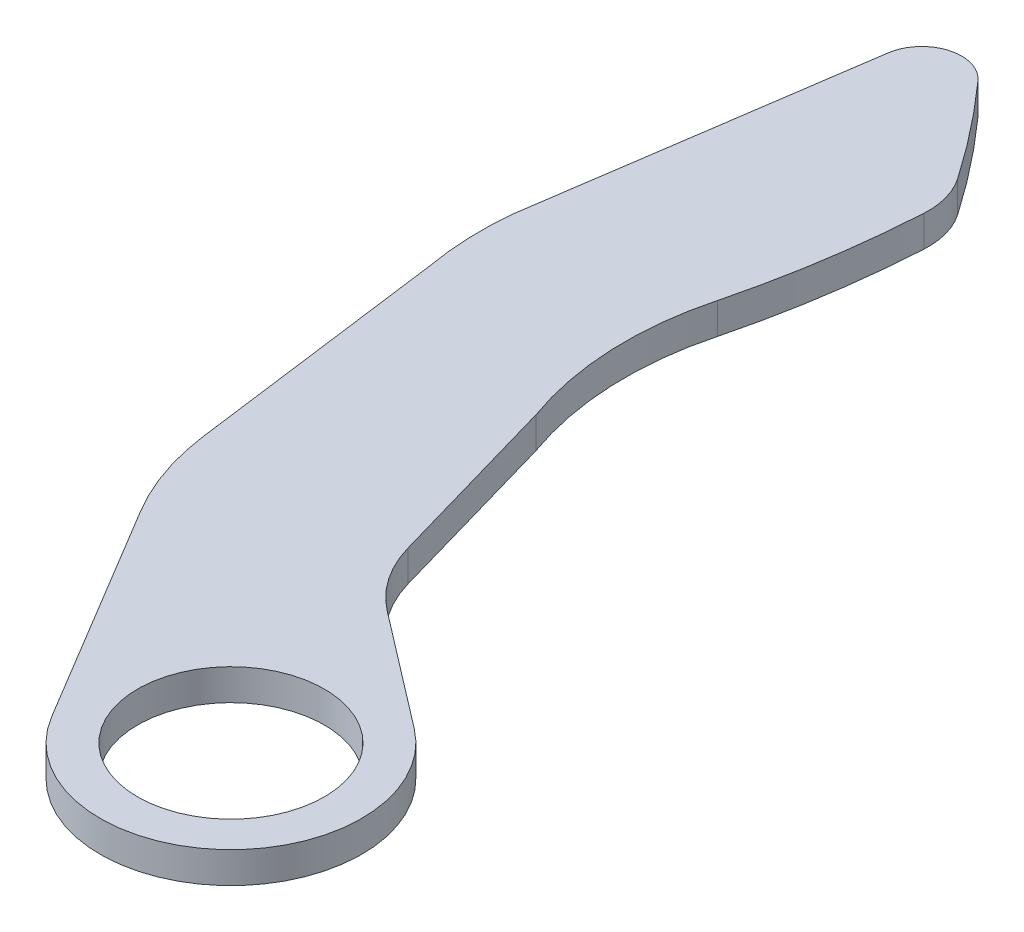
ISO-10303-21;
HEADER;
FILE_DESCRIPTION(('STEP AP214'),'2;1');
FILE_NAME('part.step','',(''),(''),'','','');
FILE_SCHEMA(('AUTOMOTIVE_DESIGN { 1 0 10303 214 1 1 1 1 }'));
ENDSEC;
DATA;
#1=APPLICATION_CONTEXT('core data for automotive mechanical design processes');
#2=APPLICATION_PROTOCOL_DEFINITION('international standard','automotive_design',2000,#1);
#3=PRODUCT_CONTEXT('',#1,'mechanical');
#4=PRODUCT('Part','Part','',(#3));
#5=PRODUCT_RELATED_PRODUCT_CATEGORY('part','',(#4));
#6=PRODUCT_DEFINITION_FORMATION('','',#4);
#7=PRODUCT_DEFINITION_CONTEXT('part definition',#1,'design');
#8=PRODUCT_DEFINITION('design','',#6,#7);
#9=PRODUCT_DEFINITION_SHAPE('','',#8);
#10=(LENGTH_UNIT() NAMED_UNIT(*) SI_UNIT(.MILLI.,.METRE.));
#11=(NAMED_UNIT(*) PLANE_ANGLE_UNIT() SI_UNIT($,.RADIAN.));
#12=(NAMED_UNIT(*) SI_UNIT($,.STERADIAN.) SOLID_ANGLE_UNIT());
#13=UNCERTAINTY_MEASURE_WITH_UNIT(LENGTH_MEASURE(1.E-05),#10,'distance_accuracy_value','');
#14=(GEOMETRIC_REPRESENTATION_CONTEXT(3) GLOBAL_UNCERTAINTY_ASSIGNED_CONTEXT((#13)) GLOBAL_UNIT_ASSIGNED_CONTEXT((#10,
#11,#12)) REPRESENTATION_CONTEXT('',''));
#15=CARTESIAN_POINT('',(0.,0.,0.));
#16=DIRECTION('',(0.,0.,1.));
#17=DIRECTION('',(1.,0.,0.));
#18=AXIS2_PLACEMENT_3D('',#15,#16,#17);
#19=CARTESIAN_POINT('',(0.,5.,0.));
#20=DIRECTION('',(0.,-1.,0.));
#21=DIRECTION('',(0.,0.,-1.));
#22=AXIS2_PLACEMENT_3D('',#19,#20,#21);
#23=PLANE('',#22);
#24=CARTESIAN_POINT('',(0.,5.,0.));
#25=DIRECTION('',(0.,1.,0.));
#26=DIRECTION('',(0.,0.,-1.));
#27=AXIS2_PLACEMENT_3D('',#24,#25,#26);
#28=CIRCLE('',#27,21.);
#29=CARTESIAN_POINT('',(-18.005501401278,5.,10.8074936635918));
#30=VERTEX_POINT('',#29);
#31=CARTESIAN_POINT('',(12.7668936687559,5.,-16.6735247038735));
#32=VERTEX_POINT('',#31);
#33=EDGE_CURVE('E194',#30,#32,#28,.T.);
#34=ORIENTED_EDGE('',*,*,#33,.T.);
#35=DIRECTION('',(-0.793977366851119,0.,-0.607947317559806));
#36=VECTOR('',#35,1.);
#37=CARTESIAN_POINT('',(12.7668936687559,5.,-16.6735247038735));
#38=LINE('',#37,#36);
#39=CARTESIAN_POINT('',(-5.80628809807091,5.,-30.8949830289071));
#40=VERTEX_POINT('',#39);
#41=EDGE_CURVE('E112',#32,#40,#38,.T.);
#42=ORIENTED_EDGE('',*,*,#41,.T.);
#43=CARTESIAN_POINT('',(6.35265825312521,5.,-46.7745303659294));
#44=DIRECTION('',(0.,-1.,0.));
#45=DIRECTION('',(0.,0.,-1.));
#46=AXIS2_PLACEMENT_3D('',#43,#44,#45);
#47=CIRCLE('',#46,20.);
#48=CARTESIAN_POINT('',(-12.8730879045012,5.,-41.2635699521255));
#49=VERTEX_POINT('',#48);
#50=EDGE_CURVE('E227',#40,#49,#47,.T.);
#51=ORIENTED_EDGE('',*,*,#50,.T.);
#52=DIRECTION('',(-0.275548020690195,0.,-0.96128730788132));
#53=VECTOR('',#52,1.);
#54=CARTESIAN_POINT('',(-12.8730879045012,5.,-41.2635699521255));
#55=LINE('',#54,#53);
#56=CARTESIAN_POINT('',(-21.1395285252071,5.,-70.1021891885652));
#57=VERTEX_POINT('',#56);
#58=EDGE_CURVE('E246',#49,#57,#55,.T.);
#59=ORIENTED_EDGE('',*,*,#58,.T.);
#60=CARTESIAN_POINT('',(26.9937980567859,5.,-87.4580042567529));
#61=DIRECTION('',(0.,-1.,0.));
#62=DIRECTION('',(0.,0.,1.));
#63=AXIS2_PLACEMENT_3D('',#60,#61,#62);
#64=CIRCLE('',#63,51.1668002178163);
#65=CARTESIAN_POINT('',(-22.4565511628832,5.,-100.599709115054));
#66=VERTEX_POINT('',#65);
#67=EDGE_CURVE('E243',#57,#66,#64,.T.);
#68=ORIENTED_EDGE('',*,*,#67,.T.);
#69=CARTESIAN_POINT('',(-171.2572125516,5.,-138.292363187831));
#70=DIRECTION('',(0.,1.,0.));
#71=DIRECTION('',(0.,0.,1.));
#72=AXIS2_PLACEMENT_3D('',#69,#70,#71);
#73=CIRCLE('',#72,153.500400653449);
#74=CARTESIAN_POINT('',(-18.0206236675566,5.,-129.296762710251));
#75=VERTEX_POINT('',#74);
#76=EDGE_CURVE('E245',#66,#75,#73,.T.);
#77=ORIENTED_EDGE('',*,*,#76,.T.);
#78=CARTESIAN_POINT('',(-30.,5.,-130.));
#79=DIRECTION('',(0.,1.,0.));
#80=DIRECTION('',(0.,0.,1.));
#81=AXIS2_PLACEMENT_3D('',#78,#79,#80);
#82=CIRCLE('',#81,12.);
#83=CARTESIAN_POINT('',(-20.1163991974912,5.,-136.805470973904));
#84=VERTEX_POINT('',#83);
#85=EDGE_CURVE('E248',#75,#84,#82,.T.);
#86=ORIENTED_EDGE('',*,*,#85,.T.);
#87=CARTESIAN_POINT('',(-146.544456121145,5.,-49.7519275464318));
#88=DIRECTION('',(0.,1.,0.));
#89=DIRECTION('',(0.,0.,1.));
#90=AXIS2_PLACEMENT_3D('',#87,#88,#89);
#91=CIRCLE('',#90,153.500400653449);
#92=CARTESIAN_POINT('',(-32.0981244877031,5.,-152.047627243035));
#93=VERTEX_POINT('',#92);
#94=EDGE_CURVE('E254',#84,#93,#91,.T.);
#95=ORIENTED_EDGE('',*,*,#94,.T.);
#96=CARTESIAN_POINT('',(-36.8667216390966,5.,-147.785306422343));
#97=DIRECTION('',(0.,1.,0.));
#98=DIRECTION('',(0.,0.,1.));
#99=AXIS2_PLACEMENT_3D('',#96,#97,#98);
#100=CIRCLE('',#99,6.39585002722699);
#101=CARTESIAN_POINT('',(-43.1946157707158,5.,-148.715173848269));
#102=VERTEX_POINT('',#101);
#103=EDGE_CURVE('E256',#93,#102,#100,.T.);
#104=ORIENTED_EDGE('',*,*,#103,.T.);
#105=DIRECTION('',(-0.145386058454699,0.,0.989375001709163));
#106=VECTOR('',#105,1.);
#107=CARTESIAN_POINT('',(-43.1946157707158,5.,-148.715173848269));
#108=LINE('',#107,#106);
#109=CARTESIAN_POINT('',(-50.9327114839769,5.,-96.0562150670269));
#110=VERTEX_POINT('',#109);
#111=EDGE_CURVE('E258',#102,#110,#108,.T.);
#112=ORIENTED_EDGE('',*,*,#111,.T.);
#113=CARTESIAN_POINT('',(0.00716740026227708,5.,-91.2426733575386));
#114=DIRECTION('',(0.,1.,0.));
#115=DIRECTION('',(0.,0.,1.));
#116=AXIS2_PLACEMENT_3D('',#113,#114,#115);
#117=CIRCLE('',#116,51.1668002178164);
#118=CARTESIAN_POINT('',(-50.3834749970696,5.,-82.3643512573803));
#119=VERTEX_POINT('',#118);
#120=EDGE_CURVE('E149',#110,#119,#117,.T.);
#121=ORIENTED_EDGE('',*,*,#120,.T.);
#122=DIRECTION('',(0.130981717678106,0.,0.991384783842325));
#123=VECTOR('',#122,1.);
#124=CARTESIAN_POINT('',(-50.3834749970696,5.,-82.3643512573803));
#125=LINE('',#124,#123);
#126=CARTESIAN_POINT('',(-44.8248822630059,5.,-40.2920349538939));
#127=VERTEX_POINT('',#126);
#128=EDGE_CURVE('E143',#119,#127,#125,.T.);
#129=ORIENTED_EDGE('',*,*,#128,.T.);
#130=CARTESIAN_POINT('',(-5.1694909093129,5.,-45.5313036610181));
#131=DIRECTION('',(0.,1.,0.));
#132=DIRECTION('',(0.,0.,1.));
#133=AXIS2_PLACEMENT_3D('',#130,#131,#132);
#134=CIRCLE('',#133,40.);
#135=CARTESIAN_POINT('',(-39.4656840546043,5.,-24.9456014446528));
#136=VERTEX_POINT('',#135);
#137=EDGE_CURVE('E147',#127,#136,#134,.T.);
#138=ORIENTED_EDGE('',*,*,#137,.T.);
#139=DIRECTION('',(0.514642555409133,0.,0.857404828632285));
#140=VECTOR('',#139,1.);
#141=CARTESIAN_POINT('',(-39.4656840546043,5.,-24.9456014446528));
#142=LINE('',#141,#140);
#143=EDGE_CURVE('E51',#136,#30,#142,.T.);
#144=ORIENTED_EDGE('',*,*,#143,.T.);
#145=EDGE_LOOP('',(#34,#42,#51,#59,#68,#77,#86,#95,#104,#112,#121,#129,#138,#144));
#146=FACE_BOUND('',#145,.T.);
#147=CARTESIAN_POINT('',(0.,5.,0.));
#148=DIRECTION('',(0.,1.,0.));
#149=DIRECTION('',(0.,0.,1.));
#150=AXIS2_PLACEMENT_3D('',#147,#148,#149);
#151=CIRCLE('',#150,15.);
#152=CARTESIAN_POINT('',(0.,5.,15.));
#153=VERTEX_POINT('',#152);
#154=EDGE_CURVE('E171',#153,#153,#151,.T.);
#155=ORIENTED_EDGE('',*,*,#154,.F.);
#156=EDGE_LOOP('',(#155));
#157=FACE_BOUND('',#156,.T.);
#158=ADVANCED_FACE('F34',(#146,#157),#23,.F.);
#159=CARTESIAN_POINT('',(0.,0.,0.));
#160=DIRECTION('',(0.,-1.,0.));
#161=DIRECTION('',(0.,0.,-1.));
#162=AXIS2_PLACEMENT_3D('',#159,#160,#161);
#163=PLANE('',#162);
#164=CARTESIAN_POINT('',(0.,0.,0.));
#165=DIRECTION('',(0.,1.,0.));
#166=DIRECTION('',(0.,0.,-1.));
#167=AXIS2_PLACEMENT_3D('',#164,#165,#166);
#168=CIRCLE('',#167,21.);
#169=CARTESIAN_POINT('',(-18.005501401278,0.,10.8074936635918));
#170=VERTEX_POINT('',#169);
#171=CARTESIAN_POINT('',(12.7668936687559,0.,-16.6735247038735));
#172=VERTEX_POINT('',#171);
#173=EDGE_CURVE('E167',#170,#172,#168,.T.);
#174=ORIENTED_EDGE('',*,*,#173,.F.);
#175=DIRECTION('',(0.514642555409133,0.,0.857404828632285));
#176=VECTOR('',#175,1.);
#177=CARTESIAN_POINT('',(-39.4656840546043,0.,-24.9456014446528));
#178=LINE('',#177,#176);
#179=CARTESIAN_POINT('',(-39.4656840546043,0.,-24.9456014446528));
#180=VERTEX_POINT('',#179);
#181=EDGE_CURVE('E104',#180,#170,#178,.T.);
#182=ORIENTED_EDGE('',*,*,#181,.F.);
#183=CARTESIAN_POINT('',(-5.1694909093129,0.,-45.5313036610181));
#184=DIRECTION('',(0.,1.,0.));
#185=DIRECTION('',(0.,0.,1.));
#186=AXIS2_PLACEMENT_3D('',#183,#184,#185);
#187=CIRCLE('',#186,40.);
#188=CARTESIAN_POINT('',(-44.8248822630059,0.,-40.2920349538939));
#189=VERTEX_POINT('',#188);
#190=EDGE_CURVE('E98',#189,#180,#187,.T.);
#191=ORIENTED_EDGE('',*,*,#190,.F.);
#192=DIRECTION('',(0.130981717678106,0.,0.991384783842325));
#193=VECTOR('',#192,1.);
#194=CARTESIAN_POINT('',(-50.3834749970696,0.,-82.3643512573803));
#195=LINE('',#194,#193);
#196=CARTESIAN_POINT('',(-50.3834749970696,0.,-82.3643512573803));
#197=VERTEX_POINT('',#196);
#198=EDGE_CURVE('E157',#197,#189,#195,.T.);
#199=ORIENTED_EDGE('',*,*,#198,.F.);
#200=CARTESIAN_POINT('',(0.00716740026227708,0.,-91.2426733575386));
#201=DIRECTION('',(0.,1.,0.));
#202=DIRECTION('',(0.,0.,1.));
#203=AXIS2_PLACEMENT_3D('',#200,#201,#202);
#204=CIRCLE('',#203,51.1668002178164);
#205=CARTESIAN_POINT('',(-50.9327114839769,0.,-96.0562150670269));
#206=VERTEX_POINT('',#205);
#207=EDGE_CURVE('E189',#206,#197,#204,.T.);
#208=ORIENTED_EDGE('',*,*,#207,.F.);
#209=DIRECTION('',(-0.145386058454699,0.,0.989375001709163));
#210=VECTOR('',#209,1.);
#211=CARTESIAN_POINT('',(-43.1946157707158,0.,-148.715173848269));
#212=LINE('',#211,#210);
#213=CARTESIAN_POINT('',(-43.1946157707158,0.,-148.715173848269));
#214=VERTEX_POINT('',#213);
#215=EDGE_CURVE('E187',#214,#206,#212,.T.);
#216=ORIENTED_EDGE('',*,*,#215,.F.);
#217=CARTESIAN_POINT('',(-36.8667216390966,0.,-147.785306422343));
#218=DIRECTION('',(0.,1.,0.));
#219=DIRECTION('',(0.,0.,1.));
#220=AXIS2_PLACEMENT_3D('',#217,#218,#219);
#221=CIRCLE('',#220,6.39585002722699);
#222=CARTESIAN_POINT('',(-32.0981244877031,0.,-152.047627243035));
#223=VERTEX_POINT('',#222);
#224=EDGE_CURVE('E185',#223,#214,#221,.T.);
#225=ORIENTED_EDGE('',*,*,#224,.F.);
#226=CARTESIAN_POINT('',(-146.544456121145,0.,-49.7519275464318));
#227=DIRECTION('',(0.,1.,0.));
#228=DIRECTION('',(0.,0.,1.));
#229=AXIS2_PLACEMENT_3D('',#226,#227,#228);
#230=CIRCLE('',#229,153.500400653449);
#231=CARTESIAN_POINT('',(-20.1163991974912,0.,-136.805470973904));
#232=VERTEX_POINT('',#231);
#233=EDGE_CURVE('E183',#232,#223,#230,.T.);
#234=ORIENTED_EDGE('',*,*,#233,.F.);
#235=CARTESIAN_POINT('',(-30.,0.,-130.));
#236=DIRECTION('',(0.,1.,0.));
#237=DIRECTION('',(0.,0.,1.));
#238=AXIS2_PLACEMENT_3D('',#235,#236,#237);
#239=CIRCLE('',#238,12.);
#240=CARTESIAN_POINT('',(-18.0206236675566,0.,-129.296762710251));
#241=VERTEX_POINT('',#240);
#242=EDGE_CURVE('E181',#241,#232,#239,.T.);
#243=ORIENTED_EDGE('',*,*,#242,.F.);
#244=CARTESIAN_POINT('',(-171.2572125516,0.,-138.292363187831));
#245=DIRECTION('',(0.,1.,0.));
#246=DIRECTION('',(0.,0.,1.));
#247=AXIS2_PLACEMENT_3D('',#244,#245,#246);
#248=CIRCLE('',#247,153.500400653449);
#249=CARTESIAN_POINT('',(-22.4565511628832,0.,-100.599709115054));
#250=VERTEX_POINT('',#249);
#251=EDGE_CURVE('E179',#250,#241,#248,.T.);
#252=ORIENTED_EDGE('',*,*,#251,.F.);
#253=CARTESIAN_POINT('',(26.9937980567859,0.,-87.4580042567529));
#254=DIRECTION('',(0.,-1.,0.));
#255=DIRECTION('',(0.,0.,1.));
#256=AXIS2_PLACEMENT_3D('',#253,#254,#255);
#257=CIRCLE('',#256,51.1668002178163);
#258=CARTESIAN_POINT('',(-21.1395285252071,0.,-70.1021891885652));
#259=VERTEX_POINT('',#258);
#260=EDGE_CURVE('E177',#259,#250,#257,.T.);
#261=ORIENTED_EDGE('',*,*,#260,.F.);
#262=DIRECTION('',(-0.275548020690195,0.,-0.96128730788132));
#263=VECTOR('',#262,1.);
#264=CARTESIAN_POINT('',(-12.8730879045012,0.,-41.2635699521255));
#265=LINE('',#264,#263);
#266=CARTESIAN_POINT('',(-12.8730879045012,0.,-41.2635699521255));
#267=VERTEX_POINT('',#266);
#268=EDGE_CURVE('E175',#267,#259,#265,.T.);
#269=ORIENTED_EDGE('',*,*,#268,.F.);
#270=CARTESIAN_POINT('',(6.35265825312521,0.,-46.7745303659294));
#271=DIRECTION('',(0.,-1.,0.));
#272=DIRECTION('',(0.,0.,-1.));
#273=AXIS2_PLACEMENT_3D('',#270,#271,#272);
#274=CIRCLE('',#273,20.);
#275=CARTESIAN_POINT('',(-5.80628809807091,0.,-30.8949830289071));
#276=VERTEX_POINT('',#275);
#277=EDGE_CURVE('E173',#276,#267,#274,.T.);
#278=ORIENTED_EDGE('',*,*,#277,.F.);
#279=DIRECTION('',(-0.793977366851119,0.,-0.607947317559806));
#280=VECTOR('',#279,1.);
#281=CARTESIAN_POINT('',(12.7668936687559,0.,-16.6735247038735));
#282=LINE('',#281,#280);
#283=EDGE_CURVE('E170',#172,#276,#282,.T.);
#284=ORIENTED_EDGE('',*,*,#283,.F.);
#285=EDGE_LOOP('',(#174,#182,#191,#199,#208,#216,#225,#234,#243,#252,#261,#269,#278,#284));
#286=FACE_BOUND('',#285,.T.);
#287=CARTESIAN_POINT('',(0.,0.,0.));
#288=DIRECTION('',(0.,1.,0.));
#289=DIRECTION('',(0.,0.,1.));
#290=AXIS2_PLACEMENT_3D('',#287,#288,#289);
#291=CIRCLE('',#290,15.);
#292=CARTESIAN_POINT('',(0.,0.,15.));
#293=VERTEX_POINT('',#292);
#294=EDGE_CURVE('E431',#293,#293,#291,.T.);
#295=ORIENTED_EDGE('',*,*,#294,.T.);
#296=EDGE_LOOP('',(#295));
#297=FACE_BOUND('',#296,.T.);
#298=ADVANCED_FACE('F231',(#286,#297),#163,.T.);
#299=CARTESIAN_POINT('',(0.,5.,0.));
#300=DIRECTION('',(0.,-1.,0.));
#301=DIRECTION('',(0.,0.,-1.));
#302=AXIS2_PLACEMENT_3D('',#299,#300,#301);
#303=CYLINDRICAL_SURFACE('',#302,21.);
#304=ORIENTED_EDGE('',*,*,#173,.T.);
#305=DIRECTION('',(0.,-1.,0.));
#306=VECTOR('',#305,1.);
#307=CARTESIAN_POINT('',(12.7668936687559,5.,-16.6735247038735));
#308=LINE('',#307,#306);
#309=EDGE_CURVE('E11',#32,#172,#308,.T.);
#310=ORIENTED_EDGE('',*,*,#309,.F.);
#311=ORIENTED_EDGE('',*,*,#33,.F.);
#312=DIRECTION('',(0.,-1.,0.));
#313=VECTOR('',#312,1.);
#314=CARTESIAN_POINT('',(-18.005501401278,5.,10.8074936635918));
#315=LINE('',#314,#313);
#316=EDGE_CURVE('E163',#30,#170,#315,.T.);
#317=ORIENTED_EDGE('',*,*,#316,.T.);
#318=EDGE_LOOP('',(#304,#310,#311,#317));
#319=FACE_BOUND('',#318,.T.);
#320=ADVANCED_FACE('F36',(#319),#303,.T.);
#321=CARTESIAN_POINT('',(12.7668936687559,5.,-16.6735247038735));
#322=DIRECTION('',(-0.607947317559806,0.,0.793977366851119));
#323=DIRECTION('',(0.793977366851119,0.,0.607947317559806));
#324=AXIS2_PLACEMENT_3D('',#321,#322,#323);
#325=PLANE('',#324);
#326=ORIENTED_EDGE('',*,*,#283,.T.);
#327=DIRECTION('',(0.,-1.,0.));
#328=VECTOR('',#327,1.);
#329=CARTESIAN_POINT('',(-5.80628809807091,5.,-30.8949830289071));
#330=LINE('',#329,#328);
#331=EDGE_CURVE('E43',#40,#276,#330,.T.);
#332=ORIENTED_EDGE('',*,*,#331,.F.);
#333=ORIENTED_EDGE('',*,*,#41,.F.);
#334=ORIENTED_EDGE('',*,*,#309,.T.);
#335=EDGE_LOOP('',(#326,#332,#333,#334));
#336=FACE_BOUND('',#335,.T.);
#337=ADVANCED_FACE('F292',(#336),#325,.F.);
#338=CARTESIAN_POINT('',(6.35265825312521,5.,-46.7745303659294));
#339=DIRECTION('',(0.,-1.,0.));
#340=DIRECTION('',(0.,0.,-1.));
#341=AXIS2_PLACEMENT_3D('',#338,#339,#340);
#342=CYLINDRICAL_SURFACE('',#341,20.);
#343=ORIENTED_EDGE('',*,*,#277,.T.);
#344=DIRECTION('',(0.,-1.,0.));
#345=VECTOR('',#344,1.);
#346=CARTESIAN_POINT('',(-12.8730879045012,5.,-41.2635699521255));
#347=LINE('',#346,#345);
#348=EDGE_CURVE('E219',#49,#267,#347,.T.);
#349=ORIENTED_EDGE('',*,*,#348,.F.);
#350=ORIENTED_EDGE('',*,*,#50,.F.);
#351=ORIENTED_EDGE('',*,*,#331,.T.);
#352=EDGE_LOOP('',(#343,#349,#350,#351));
#353=FACE_BOUND('',#352,.T.);
#354=ADVANCED_FACE('F225',(#353),#342,.F.);
#355=CARTESIAN_POINT('',(-12.8730879045012,5.,-41.2635699521255));
#356=DIRECTION('',(-0.96128730788132,0.,0.275548020690195));
#357=DIRECTION('',(0.275548020690195,0.,0.96128730788132));
#358=AXIS2_PLACEMENT_3D('',#355,#356,#357);
#359=PLANE('',#358);
#360=ORIENTED_EDGE('',*,*,#268,.T.);
#361=DIRECTION('',(0.,-1.,0.));
#362=VECTOR('',#361,1.);
#363=CARTESIAN_POINT('',(-21.1395285252071,5.,-70.1021891885652));
#364=LINE('',#363,#362);
#365=EDGE_CURVE('E216',#57,#259,#364,.T.);
#366=ORIENTED_EDGE('',*,*,#365,.F.);
#367=ORIENTED_EDGE('',*,*,#58,.F.);
#368=ORIENTED_EDGE('',*,*,#348,.T.);
#369=EDGE_LOOP('',(#360,#366,#367,#368));
#370=FACE_BOUND('',#369,.T.);
#371=ADVANCED_FACE('F237',(#370),#359,.F.);
#372=CARTESIAN_POINT('',(26.9937980567859,5.,-87.4580042567529));
#373=DIRECTION('',(0.,-1.,0.));
#374=DIRECTION('',(0.,0.,-1.));
#375=AXIS2_PLACEMENT_3D('',#372,#373,#374);
#376=CYLINDRICAL_SURFACE('',#375,51.1668002178163);
#377=ORIENTED_EDGE('',*,*,#260,.T.);
#378=DIRECTION('',(0.,-1.,0.));
#379=VECTOR('',#378,1.);
#380=CARTESIAN_POINT('',(-22.4565511628832,5.,-100.599709115054));
#381=LINE('',#380,#379);
#382=EDGE_CURVE('E213',#66,#250,#381,.T.);
#383=ORIENTED_EDGE('',*,*,#382,.F.);
#384=ORIENTED_EDGE('',*,*,#67,.F.);
#385=ORIENTED_EDGE('',*,*,#365,.T.);
#386=EDGE_LOOP('',(#377,#383,#384,#385));
#387=FACE_BOUND('',#386,.T.);
#388=ADVANCED_FACE('F241',(#387),#376,.F.);
#389=CARTESIAN_POINT('',(-171.2572125516,5.,-138.292363187831));
#390=DIRECTION('',(0.,-1.,0.));
#391=DIRECTION('',(0.,0.,-1.));
#392=AXIS2_PLACEMENT_3D('',#389,#390,#391);
#393=CYLINDRICAL_SURFACE('',#392,153.500400653449);
#394=ORIENTED_EDGE('',*,*,#251,.T.);
#395=DIRECTION('',(0.,-1.,0.));
#396=VECTOR('',#395,1.);
#397=CARTESIAN_POINT('',(-18.0206236675566,5.,-129.296762710251));
#398=LINE('',#397,#396);
#399=EDGE_CURVE('E210',#75,#241,#398,.T.);
#400=ORIENTED_EDGE('',*,*,#399,.F.);
#401=ORIENTED_EDGE('',*,*,#76,.F.);
#402=ORIENTED_EDGE('',*,*,#382,.T.);
#403=EDGE_LOOP('',(#394,#400,#401,#402));
#404=FACE_BOUND('',#403,.T.);
#405=ADVANCED_FACE('F305',(#404),#393,.T.);
#406=CARTESIAN_POINT('',(-30.,5.,-130.));
#407=DIRECTION('',(0.,-1.,0.));
#408=DIRECTION('',(0.,0.,-1.));
#409=AXIS2_PLACEMENT_3D('',#406,#407,#408);
#410=CYLINDRICAL_SURFACE('',#409,12.);
#411=ORIENTED_EDGE('',*,*,#242,.T.);
#412=DIRECTION('',(0.,-1.,0.));
#413=VECTOR('',#412,1.);
#414=CARTESIAN_POINT('',(-20.1163991974912,5.,-136.805470973904));
#415=LINE('',#414,#413);
#416=EDGE_CURVE('E207',#84,#232,#415,.T.);
#417=ORIENTED_EDGE('',*,*,#416,.F.);
#418=ORIENTED_EDGE('',*,*,#85,.F.);
#419=ORIENTED_EDGE('',*,*,#399,.T.);
#420=EDGE_LOOP('',(#411,#417,#418,#419));
#421=FACE_BOUND('',#420,.T.);
#422=ADVANCED_FACE('F308',(#421),#410,.T.);
#423=CARTESIAN_POINT('',(-146.544456121145,5.,-49.7519275464318));
#424=DIRECTION('',(0.,-1.,0.));
#425=DIRECTION('',(0.,0.,-1.));
#426=AXIS2_PLACEMENT_3D('',#423,#424,#425);
#427=CYLINDRICAL_SURFACE('',#426,153.500400653449);
#428=ORIENTED_EDGE('',*,*,#233,.T.);
#429=DIRECTION('',(0.,-1.,0.));
#430=VECTOR('',#429,1.);
#431=CARTESIAN_POINT('',(-32.0981244877031,5.,-152.047627243035));
#432=LINE('',#431,#430);
#433=EDGE_CURVE('E204',#93,#223,#432,.T.);
#434=ORIENTED_EDGE('',*,*,#433,.F.);
#435=ORIENTED_EDGE('',*,*,#94,.F.);
#436=ORIENTED_EDGE('',*,*,#416,.T.);
#437=EDGE_LOOP('',(#428,#434,#435,#436));
#438=FACE_BOUND('',#437,.T.);
#439=ADVANCED_FACE('F312',(#438),#427,.T.);
#440=CARTESIAN_POINT('',(-36.8667216390966,5.,-147.785306422343));
#441=DIRECTION('',(0.,-1.,0.));
#442=DIRECTION('',(0.,0.,-1.));
#443=AXIS2_PLACEMENT_3D('',#440,#441,#442);
#444=CYLINDRICAL_SURFACE('',#443,6.39585002722699);
#445=ORIENTED_EDGE('',*,*,#224,.T.);
#446=DIRECTION('',(0.,-1.,0.));
#447=VECTOR('',#446,1.);
#448=CARTESIAN_POINT('',(-43.1946157707158,5.,-148.715173848269));
#449=LINE('',#448,#447);
#450=EDGE_CURVE('E201',#102,#214,#449,.T.);
#451=ORIENTED_EDGE('',*,*,#450,.F.);
#452=ORIENTED_EDGE('',*,*,#103,.F.);
#453=ORIENTED_EDGE('',*,*,#433,.T.);
#454=EDGE_LOOP('',(#445,#451,#452,#453));
#455=FACE_BOUND('',#454,.T.);
#456=ADVANCED_FACE('F316',(#455),#444,.T.);
#457=CARTESIAN_POINT('',(-43.1946157707158,5.,-148.715173848269));
#458=DIRECTION('',(0.989375001709163,0.,0.145386058454699));
#459=DIRECTION('',(0.145386058454699,0.,-0.989375001709163));
#460=AXIS2_PLACEMENT_3D('',#457,#458,#459);
#461=PLANE('',#460);
#462=ORIENTED_EDGE('',*,*,#215,.T.);
#463=DIRECTION('',(0.,-1.,0.));
#464=VECTOR('',#463,1.);
#465=CARTESIAN_POINT('',(-50.9327114839769,5.,-96.0562150670269));
#466=LINE('',#465,#464);
#467=EDGE_CURVE('E198',#110,#206,#466,.T.);
#468=ORIENTED_EDGE('',*,*,#467,.F.);
#469=ORIENTED_EDGE('',*,*,#111,.F.);
#470=ORIENTED_EDGE('',*,*,#450,.T.);
#471=EDGE_LOOP('',(#462,#468,#469,#470));
#472=FACE_BOUND('',#471,.T.);
#473=ADVANCED_FACE('F264',(#472),#461,.F.);
#474=CARTESIAN_POINT('',(0.00716740026227708,5.,-91.2426733575386));
#475=DIRECTION('',(0.,-1.,0.));
#476=DIRECTION('',(0.,0.,-1.));
#477=AXIS2_PLACEMENT_3D('',#474,#475,#476);
#478=CYLINDRICAL_SURFACE('',#477,51.1668002178164);
#479=ORIENTED_EDGE('',*,*,#207,.T.);
#480=DIRECTION('',(0.,-1.,0.));
#481=VECTOR('',#480,1.);
#482=CARTESIAN_POINT('',(-50.3834749970696,5.,-82.3643512573803));
#483=LINE('',#482,#481);
#484=EDGE_CURVE('E158',#119,#197,#483,.T.);
#485=ORIENTED_EDGE('',*,*,#484,.F.);
#486=ORIENTED_EDGE('',*,*,#120,.F.);
#487=ORIENTED_EDGE('',*,*,#467,.T.);
#488=EDGE_LOOP('',(#479,#485,#486,#487));
#489=FACE_BOUND('',#488,.T.);
#490=ADVANCED_FACE('F268',(#489),#478,.T.);
#491=CARTESIAN_POINT('',(-50.3834749970696,5.,-82.3643512573803));
#492=DIRECTION('',(0.991384783842325,0.,-0.130981717678106));
#493=DIRECTION('',(-0.130981717678106,0.,-0.991384783842325));
#494=AXIS2_PLACEMENT_3D('',#491,#492,#493);
#495=PLANE('',#494);
#496=ORIENTED_EDGE('',*,*,#198,.T.);
#497=DIRECTION('',(0.,-1.,0.));
#498=VECTOR('',#497,1.);
#499=CARTESIAN_POINT('',(-44.8248822630059,5.,-40.2920349538939));
#500=LINE('',#499,#498);
#501=EDGE_CURVE('E154',#127,#189,#500,.T.);
#502=ORIENTED_EDGE('',*,*,#501,.F.);
#503=ORIENTED_EDGE('',*,*,#128,.F.);
#504=ORIENTED_EDGE('',*,*,#484,.T.);
#505=EDGE_LOOP('',(#496,#502,#503,#504));
#506=FACE_BOUND('',#505,.T.);
#507=ADVANCED_FACE('F155',(#506),#495,.F.);
#508=CARTESIAN_POINT('',(-5.1694909093129,5.,-45.5313036610181));
#509=DIRECTION('',(0.,-1.,0.));
#510=DIRECTION('',(0.,0.,-1.));
#511=AXIS2_PLACEMENT_3D('',#508,#509,#510);
#512=CYLINDRICAL_SURFACE('',#511,40.);
#513=ORIENTED_EDGE('',*,*,#190,.T.);
#514=DIRECTION('',(0.,-1.,0.));
#515=VECTOR('',#514,1.);
#516=CARTESIAN_POINT('',(-39.4656840546043,5.,-24.9456014446528));
#517=LINE('',#516,#515);
#518=EDGE_CURVE('E159',#136,#180,#517,.T.);
#519=ORIENTED_EDGE('',*,*,#518,.F.);
#520=ORIENTED_EDGE('',*,*,#137,.F.);
#521=ORIENTED_EDGE('',*,*,#501,.T.);
#522=EDGE_LOOP('',(#513,#519,#520,#521));
#523=FACE_BOUND('',#522,.T.);
#524=ADVANCED_FACE('F161',(#523),#512,.T.);
#525=CARTESIAN_POINT('',(-39.4656840546043,5.,-24.9456014446528));
#526=DIRECTION('',(0.857404828632285,0.,-0.514642555409133));
#527=DIRECTION('',(-0.514642555409133,0.,-0.857404828632285));
#528=AXIS2_PLACEMENT_3D('',#525,#526,#527);
#529=PLANE('',#528);
#530=ORIENTED_EDGE('',*,*,#181,.T.);
#531=ORIENTED_EDGE('',*,*,#316,.F.);
#532=ORIENTED_EDGE('',*,*,#143,.F.);
#533=ORIENTED_EDGE('',*,*,#518,.T.);
#534=EDGE_LOOP('',(#530,#531,#532,#533));
#535=FACE_BOUND('',#534,.T.);
#536=ADVANCED_FACE('F272',(#535),#529,.F.);
#537=CARTESIAN_POINT('',(0.,5.,0.));
#538=DIRECTION('',(0.,-1.,0.));
#539=DIRECTION('',(0.,0.,-1.));
#540=AXIS2_PLACEMENT_3D('',#537,#538,#539);
#541=CYLINDRICAL_SURFACE('',#540,15.);
#542=ORIENTED_EDGE('',*,*,#154,.T.);
#543=EDGE_LOOP('',(#542));
#544=FACE_BOUND('',#543,.T.);
#545=ORIENTED_EDGE('',*,*,#294,.F.);
#546=EDGE_LOOP('',(#545));
#547=FACE_BOUND('',#546,.T.);
#548=ADVANCED_FACE('F274',(#544,#547),#541,.F.);
#549=CLOSED_SHELL('',(#158,#298,#320,#337,#354,#371,#388,#405,#422,#439,#456,#473,#490,#507,
#524,#536,#548));
#550=MANIFOLD_SOLID_BREP('B2',#549);
#551=ADVANCED_BREP_SHAPE_REPRESENTATION('',(#18,#550),#14);
#552=SHAPE_DEFINITION_REPRESENTATION(#9,#551);
ENDSEC;
END-ISO-10303-21;
